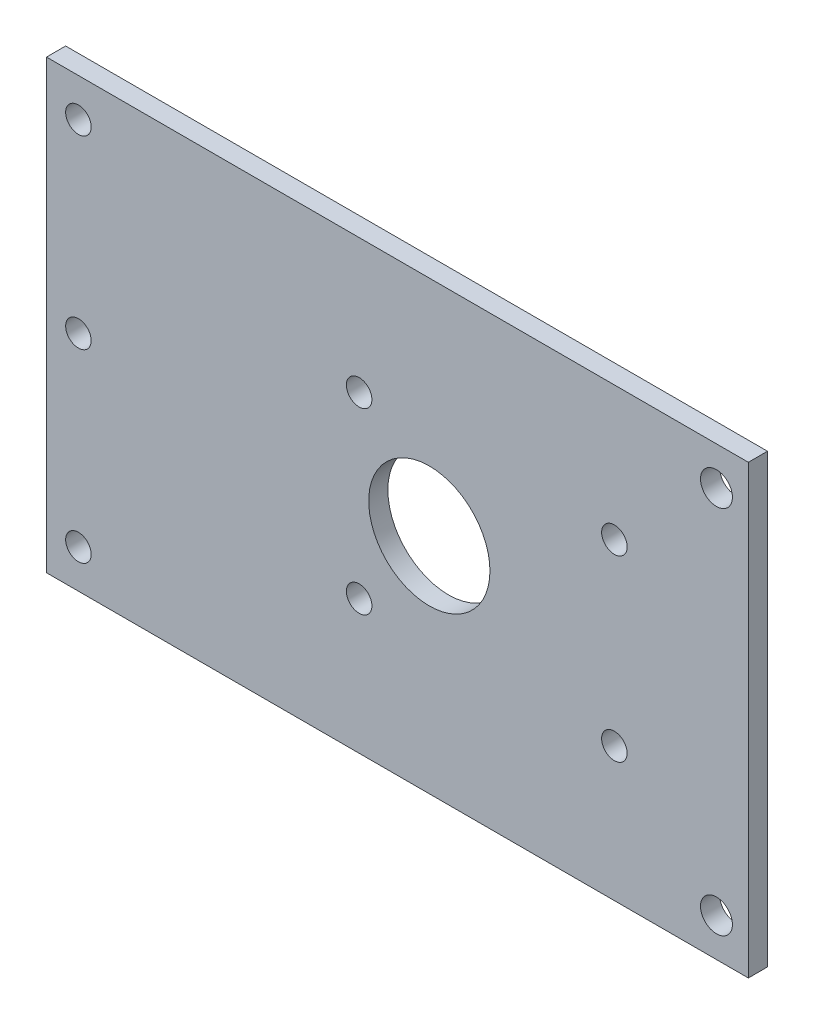
ISO-10303-21;
HEADER;
FILE_DESCRIPTION(('STEP AP214'),'2;1');
FILE_NAME('part.step','',(''),(''),'','','');
FILE_SCHEMA(('AUTOMOTIVE_DESIGN { 1 0 10303 214 1 1 1 1 }'));
ENDSEC;
DATA;
#1=APPLICATION_CONTEXT('core data for automotive mechanical design processes');
#2=APPLICATION_PROTOCOL_DEFINITION('international standard','automotive_design',2000,#1);
#3=PRODUCT_CONTEXT('',#1,'mechanical');
#4=PRODUCT('Part','Part','',(#3));
#5=PRODUCT_RELATED_PRODUCT_CATEGORY('part','',(#4));
#6=PRODUCT_DEFINITION_FORMATION('','',#4);
#7=PRODUCT_DEFINITION_CONTEXT('part definition',#1,'design');
#8=PRODUCT_DEFINITION('design','',#6,#7);
#9=PRODUCT_DEFINITION_SHAPE('','',#8);
#10=(LENGTH_UNIT() NAMED_UNIT(*) SI_UNIT(.MILLI.,.METRE.));
#11=(NAMED_UNIT(*) PLANE_ANGLE_UNIT() SI_UNIT($,.RADIAN.));
#12=(NAMED_UNIT(*) SI_UNIT($,.STERADIAN.) SOLID_ANGLE_UNIT());
#13=UNCERTAINTY_MEASURE_WITH_UNIT(LENGTH_MEASURE(1.E-05),#10,'distance_accuracy_value','');
#14=(GEOMETRIC_REPRESENTATION_CONTEXT(3) GLOBAL_UNCERTAINTY_ASSIGNED_CONTEXT((#13)) GLOBAL_UNIT_ASSIGNED_CONTEXT((#10,
#11,#12)) REPRESENTATION_CONTEXT('',''));
#15=CARTESIAN_POINT('',(0.,0.,0.));
#16=DIRECTION('',(0.,0.,1.));
#17=DIRECTION('',(1.,0.,0.));
#18=AXIS2_PLACEMENT_3D('',#15,#16,#17);
#19=CARTESIAN_POINT('',(0.,0.,3.));
#20=DIRECTION('',(1.,0.,0.));
#21=DIRECTION('',(0.,0.,-1.));
#22=AXIS2_PLACEMENT_3D('',#19,#20,#21);
#23=PLANE('',#22);
#24=DIRECTION('',(0.,-1.,0.));
#25=VECTOR('',#24,1.);
#26=CARTESIAN_POINT('',(0.,0.,0.));
#27=LINE('',#26,#25);
#28=CARTESIAN_POINT('',(0.,70.,0.));
#29=VERTEX_POINT('',#28);
#30=CARTESIAN_POINT('',(0.,0.,0.));
#31=VERTEX_POINT('',#30);
#32=EDGE_CURVE('E102',#29,#31,#27,.T.);
#33=ORIENTED_EDGE('',*,*,#32,.T.);
#34=DIRECTION('',(0.,0.,-1.));
#35=VECTOR('',#34,1.);
#36=CARTESIAN_POINT('',(0.,0.,3.));
#37=LINE('',#36,#35);
#38=CARTESIAN_POINT('',(0.,0.,3.));
#39=VERTEX_POINT('',#38);
#40=EDGE_CURVE('E11',#39,#31,#37,.T.);
#41=ORIENTED_EDGE('',*,*,#40,.F.);
#42=DIRECTION('',(0.,-1.,0.));
#43=VECTOR('',#42,1.);
#44=CARTESIAN_POINT('',(0.,0.,3.));
#45=LINE('',#44,#43);
#46=CARTESIAN_POINT('',(0.,70.,3.));
#47=VERTEX_POINT('',#46);
#48=EDGE_CURVE('E89',#47,#39,#45,.T.);
#49=ORIENTED_EDGE('',*,*,#48,.F.);
#50=DIRECTION('',(0.,0.,-1.));
#51=VECTOR('',#50,1.);
#52=CARTESIAN_POINT('',(0.,70.,3.));
#53=LINE('',#52,#51);
#54=EDGE_CURVE('E98',#47,#29,#53,.T.);
#55=ORIENTED_EDGE('',*,*,#54,.T.);
#56=EDGE_LOOP('',(#33,#41,#49,#55));
#57=FACE_BOUND('',#56,.T.);
#58=ADVANCED_FACE('F36',(#57),#23,.F.);
#59=CARTESIAN_POINT('',(0.,0.,3.));
#60=DIRECTION('',(0.,1.,0.));
#61=DIRECTION('',(0.,0.,1.));
#62=AXIS2_PLACEMENT_3D('',#59,#60,#61);
#63=PLANE('',#62);
#64=DIRECTION('',(1.,0.,0.));
#65=VECTOR('',#64,1.);
#66=CARTESIAN_POINT('',(0.,0.,0.));
#67=LINE('',#66,#65);
#68=CARTESIAN_POINT('',(110.,0.,0.));
#69=VERTEX_POINT('',#68);
#70=EDGE_CURVE('E93',#31,#69,#67,.T.);
#71=ORIENTED_EDGE('',*,*,#70,.T.);
#72=DIRECTION('',(0.,0.,-1.));
#73=VECTOR('',#72,1.);
#74=CARTESIAN_POINT('',(110.,0.,3.));
#75=LINE('',#74,#73);
#76=CARTESIAN_POINT('',(110.,0.,3.));
#77=VERTEX_POINT('',#76);
#78=EDGE_CURVE('E45',#77,#69,#75,.T.);
#79=ORIENTED_EDGE('',*,*,#78,.F.);
#80=DIRECTION('',(1.,0.,0.));
#81=VECTOR('',#80,1.);
#82=CARTESIAN_POINT('',(0.,0.,3.));
#83=LINE('',#82,#81);
#84=EDGE_CURVE('E84',#39,#77,#83,.T.);
#85=ORIENTED_EDGE('',*,*,#84,.F.);
#86=ORIENTED_EDGE('',*,*,#40,.T.);
#87=EDGE_LOOP('',(#71,#79,#85,#86));
#88=FACE_BOUND('',#87,.T.);
#89=ADVANCED_FACE('F92',(#88),#63,.F.);
#90=CARTESIAN_POINT('',(110.,0.,3.));
#91=DIRECTION('',(-1.,0.,0.));
#92=DIRECTION('',(0.,0.,1.));
#93=AXIS2_PLACEMENT_3D('',#90,#91,#92);
#94=PLANE('',#93);
#95=DIRECTION('',(0.,1.,0.));
#96=VECTOR('',#95,1.);
#97=CARTESIAN_POINT('',(110.,0.,0.));
#98=LINE('',#97,#96);
#99=CARTESIAN_POINT('',(110.,70.,0.));
#100=VERTEX_POINT('',#99);
#101=EDGE_CURVE('E71',#69,#100,#98,.T.);
#102=ORIENTED_EDGE('',*,*,#101,.T.);
#103=DIRECTION('',(0.,0.,-1.));
#104=VECTOR('',#103,1.);
#105=CARTESIAN_POINT('',(110.,70.,3.));
#106=LINE('',#105,#104);
#107=CARTESIAN_POINT('',(110.,70.,3.));
#108=VERTEX_POINT('',#107);
#109=EDGE_CURVE('E94',#108,#100,#106,.T.);
#110=ORIENTED_EDGE('',*,*,#109,.F.);
#111=DIRECTION('',(0.,1.,0.));
#112=VECTOR('',#111,1.);
#113=CARTESIAN_POINT('',(110.,0.,3.));
#114=LINE('',#113,#112);
#115=EDGE_CURVE('E87',#77,#108,#114,.T.);
#116=ORIENTED_EDGE('',*,*,#115,.F.);
#117=ORIENTED_EDGE('',*,*,#78,.T.);
#118=EDGE_LOOP('',(#102,#110,#116,#117));
#119=FACE_BOUND('',#118,.T.);
#120=ADVANCED_FACE('F96',(#119),#94,.F.);
#121=CARTESIAN_POINT('',(0.,70.,3.));
#122=DIRECTION('',(0.,-1.,0.));
#123=DIRECTION('',(0.,0.,-1.));
#124=AXIS2_PLACEMENT_3D('',#121,#122,#123);
#125=PLANE('',#124);
#126=DIRECTION('',(-1.,0.,0.));
#127=VECTOR('',#126,1.);
#128=CARTESIAN_POINT('',(0.,70.,0.));
#129=LINE('',#128,#127);
#130=EDGE_CURVE('E77',#100,#29,#129,.T.);
#131=ORIENTED_EDGE('',*,*,#130,.T.);
#132=ORIENTED_EDGE('',*,*,#54,.F.);
#133=DIRECTION('',(-1.,0.,0.));
#134=VECTOR('',#133,1.);
#135=CARTESIAN_POINT('',(0.,70.,3.));
#136=LINE('',#135,#134);
#137=EDGE_CURVE('E54',#108,#47,#136,.T.);
#138=ORIENTED_EDGE('',*,*,#137,.F.);
#139=ORIENTED_EDGE('',*,*,#109,.T.);
#140=EDGE_LOOP('',(#131,#132,#138,#139));
#141=FACE_BOUND('',#140,.T.);
#142=ADVANCED_FACE('F165',(#141),#125,.F.);
#143=CARTESIAN_POINT('',(0.,0.,3.));
#144=DIRECTION('',(0.,0.,-1.));
#145=DIRECTION('',(-1.,0.,0.));
#146=AXIS2_PLACEMENT_3D('',#143,#144,#145);
#147=PLANE('',#146);
#148=CARTESIAN_POINT('',(49.,21.,3.));
#149=DIRECTION('',(0.,0.,1.));
#150=DIRECTION('',(-1.,0.,0.));
#151=AXIS2_PLACEMENT_3D('',#148,#149,#150);
#152=CIRCLE('',#151,2.);
#153=CARTESIAN_POINT('',(47.,21.,3.));
#154=VERTEX_POINT('',#153);
#155=EDGE_CURVE('E307',#154,#154,#152,.T.);
#156=ORIENTED_EDGE('',*,*,#155,.F.);
#157=EDGE_LOOP('',(#156));
#158=FACE_BOUND('',#157,.T.);
#159=CARTESIAN_POINT('',(89.,21.,3.));
#160=DIRECTION('',(0.,0.,1.));
#161=DIRECTION('',(-1.,0.,0.));
#162=AXIS2_PLACEMENT_3D('',#159,#160,#161);
#163=CIRCLE('',#162,2.);
#164=CARTESIAN_POINT('',(87.,21.,3.));
#165=VERTEX_POINT('',#164);
#166=EDGE_CURVE('E308',#165,#165,#163,.T.);
#167=ORIENTED_EDGE('',*,*,#166,.F.);
#168=EDGE_LOOP('',(#167));
#169=FACE_BOUND('',#168,.T.);
#170=CARTESIAN_POINT('',(89.,49.,3.));
#171=DIRECTION('',(0.,0.,1.));
#172=DIRECTION('',(1.,0.,0.));
#173=AXIS2_PLACEMENT_3D('',#170,#171,#172);
#174=CIRCLE('',#173,2.);
#175=CARTESIAN_POINT('',(91.,49.,3.));
#176=VERTEX_POINT('',#175);
#177=EDGE_CURVE('E311',#176,#176,#174,.T.);
#178=ORIENTED_EDGE('',*,*,#177,.F.);
#179=EDGE_LOOP('',(#178));
#180=FACE_BOUND('',#179,.T.);
#181=CARTESIAN_POINT('',(49.,49.,3.));
#182=DIRECTION('',(0.,0.,1.));
#183=DIRECTION('',(1.,0.,0.));
#184=AXIS2_PLACEMENT_3D('',#181,#182,#183);
#185=CIRCLE('',#184,2.);
#186=CARTESIAN_POINT('',(51.,49.,3.));
#187=VERTEX_POINT('',#186);
#188=EDGE_CURVE('E315',#187,#187,#185,.T.);
#189=ORIENTED_EDGE('',*,*,#188,.F.);
#190=EDGE_LOOP('',(#189));
#191=FACE_BOUND('',#190,.T.);
#192=CARTESIAN_POINT('',(60.,35.,3.));
#193=DIRECTION('',(0.,0.,1.));
#194=DIRECTION('',(1.,0.,0.));
#195=AXIS2_PLACEMENT_3D('',#192,#193,#194);
#196=CIRCLE('',#195,9.5);
#197=CARTESIAN_POINT('',(69.5,35.,3.));
#198=VERTEX_POINT('',#197);
#199=EDGE_CURVE('E130',#198,#198,#196,.T.);
#200=ORIENTED_EDGE('',*,*,#199,.F.);
#201=EDGE_LOOP('',(#200));
#202=FACE_BOUND('',#201,.T.);
#203=CARTESIAN_POINT('',(5.,6.,3.));
#204=DIRECTION('',(0.,0.,1.));
#205=DIRECTION('',(1.,0.,0.));
#206=AXIS2_PLACEMENT_3D('',#203,#204,#205);
#207=CIRCLE('',#206,2.);
#208=CARTESIAN_POINT('',(7.,6.,3.));
#209=VERTEX_POINT('',#208);
#210=EDGE_CURVE('E153',#209,#209,#207,.T.);
#211=ORIENTED_EDGE('',*,*,#210,.F.);
#212=EDGE_LOOP('',(#211));
#213=FACE_BOUND('',#212,.T.);
#214=CARTESIAN_POINT('',(105.,64.,3.));
#215=DIRECTION('',(0.,0.,1.));
#216=DIRECTION('',(1.,0.,0.));
#217=AXIS2_PLACEMENT_3D('',#214,#215,#216);
#218=CIRCLE('',#217,2.50000000000001);
#219=CARTESIAN_POINT('',(107.5,64.,3.));
#220=VERTEX_POINT('',#219);
#221=EDGE_CURVE('E149',#220,#220,#218,.T.);
#222=ORIENTED_EDGE('',*,*,#221,.F.);
#223=EDGE_LOOP('',(#222));
#224=FACE_BOUND('',#223,.T.);
#225=CARTESIAN_POINT('',(105.,6.,3.));
#226=DIRECTION('',(0.,0.,1.));
#227=DIRECTION('',(1.,0.,0.));
#228=AXIS2_PLACEMENT_3D('',#225,#226,#227);
#229=CIRCLE('',#228,2.49999999999999);
#230=CARTESIAN_POINT('',(107.5,6.,3.));
#231=VERTEX_POINT('',#230);
#232=EDGE_CURVE('E144',#231,#231,#229,.T.);
#233=ORIENTED_EDGE('',*,*,#232,.F.);
#234=EDGE_LOOP('',(#233));
#235=FACE_BOUND('',#234,.T.);
#236=CARTESIAN_POINT('',(5.,35.,3.));
#237=DIRECTION('',(0.,0.,1.));
#238=DIRECTION('',(1.,0.,0.));
#239=AXIS2_PLACEMENT_3D('',#236,#237,#238);
#240=CIRCLE('',#239,2.);
#241=CARTESIAN_POINT('',(7.00000000000001,35.,3.));
#242=VERTEX_POINT('',#241);
#243=EDGE_CURVE('E140',#242,#242,#240,.T.);
#244=ORIENTED_EDGE('',*,*,#243,.F.);
#245=EDGE_LOOP('',(#244));
#246=FACE_BOUND('',#245,.T.);
#247=CARTESIAN_POINT('',(5.,64.,3.));
#248=DIRECTION('',(0.,0.,1.));
#249=DIRECTION('',(1.,0.,0.));
#250=AXIS2_PLACEMENT_3D('',#247,#248,#249);
#251=CIRCLE('',#250,2.);
#252=CARTESIAN_POINT('',(7.00000000000001,64.,3.));
#253=VERTEX_POINT('',#252);
#254=EDGE_CURVE('E115',#253,#253,#251,.T.);
#255=ORIENTED_EDGE('',*,*,#254,.F.);
#256=EDGE_LOOP('',(#255));
#257=FACE_BOUND('',#256,.T.);
#258=ORIENTED_EDGE('',*,*,#48,.T.);
#259=ORIENTED_EDGE('',*,*,#84,.T.);
#260=ORIENTED_EDGE('',*,*,#115,.T.);
#261=ORIENTED_EDGE('',*,*,#137,.T.);
#262=EDGE_LOOP('',(#258,#259,#260,#261));
#263=FACE_BOUND('',#262,.T.);
#264=ADVANCED_FACE('F85',(#158,#169,#180,#191,#202,#213,#224,#235,#246,#257,#263),#147,.F.);
#265=CARTESIAN_POINT('',(0.,0.,0.));
#266=DIRECTION('',(0.,0.,-1.));
#267=DIRECTION('',(-1.,0.,0.));
#268=AXIS2_PLACEMENT_3D('',#265,#266,#267);
#269=PLANE('',#268);
#270=CARTESIAN_POINT('',(49.,21.,0.));
#271=DIRECTION('',(0.,0.,-1.));
#272=DIRECTION('',(-1.,0.,0.));
#273=AXIS2_PLACEMENT_3D('',#270,#271,#272);
#274=CIRCLE('',#273,2.);
#275=CARTESIAN_POINT('',(47.,21.,0.));
#276=VERTEX_POINT('',#275);
#277=EDGE_CURVE('E39',#276,#276,#274,.T.);
#278=ORIENTED_EDGE('',*,*,#277,.F.);
#279=EDGE_LOOP('',(#278));
#280=FACE_BOUND('',#279,.T.);
#281=CARTESIAN_POINT('',(89.,21.,0.));
#282=DIRECTION('',(0.,0.,-1.));
#283=DIRECTION('',(-1.,0.,0.));
#284=AXIS2_PLACEMENT_3D('',#281,#282,#283);
#285=CIRCLE('',#284,2.);
#286=CARTESIAN_POINT('',(87.,21.,0.));
#287=VERTEX_POINT('',#286);
#288=EDGE_CURVE('E135',#287,#287,#285,.T.);
#289=ORIENTED_EDGE('',*,*,#288,.F.);
#290=EDGE_LOOP('',(#289));
#291=FACE_BOUND('',#290,.T.);
#292=CARTESIAN_POINT('',(89.,49.,0.));
#293=DIRECTION('',(0.,0.,-1.));
#294=DIRECTION('',(-1.,0.,0.));
#295=AXIS2_PLACEMENT_3D('',#292,#293,#294);
#296=CIRCLE('',#295,2.);
#297=CARTESIAN_POINT('',(87.,49.,0.));
#298=VERTEX_POINT('',#297);
#299=EDGE_CURVE('E133',#298,#298,#296,.T.);
#300=ORIENTED_EDGE('',*,*,#299,.F.);
#301=EDGE_LOOP('',(#300));
#302=FACE_BOUND('',#301,.T.);
#303=CARTESIAN_POINT('',(49.,49.,0.));
#304=DIRECTION('',(0.,0.,-1.));
#305=DIRECTION('',(-1.,0.,0.));
#306=AXIS2_PLACEMENT_3D('',#303,#304,#305);
#307=CIRCLE('',#306,2.);
#308=CARTESIAN_POINT('',(47.,49.,0.));
#309=VERTEX_POINT('',#308);
#310=EDGE_CURVE('E129',#309,#309,#307,.T.);
#311=ORIENTED_EDGE('',*,*,#310,.F.);
#312=EDGE_LOOP('',(#311));
#313=FACE_BOUND('',#312,.T.);
#314=CARTESIAN_POINT('',(60.,35.,0.));
#315=DIRECTION('',(0.,0.,-1.));
#316=DIRECTION('',(-1.,0.,0.));
#317=AXIS2_PLACEMENT_3D('',#314,#315,#316);
#318=CIRCLE('',#317,9.5);
#319=CARTESIAN_POINT('',(50.5,35.,0.));
#320=VERTEX_POINT('',#319);
#321=EDGE_CURVE('E126',#320,#320,#318,.T.);
#322=ORIENTED_EDGE('',*,*,#321,.F.);
#323=EDGE_LOOP('',(#322));
#324=FACE_BOUND('',#323,.T.);
#325=CARTESIAN_POINT('',(5.,6.,0.));
#326=DIRECTION('',(0.,0.,-1.));
#327=DIRECTION('',(-1.,0.,0.));
#328=AXIS2_PLACEMENT_3D('',#325,#326,#327);
#329=CIRCLE('',#328,2.);
#330=CARTESIAN_POINT('',(3.,6.,0.));
#331=VERTEX_POINT('',#330);
#332=EDGE_CURVE('E105',#331,#331,#329,.T.);
#333=ORIENTED_EDGE('',*,*,#332,.F.);
#334=EDGE_LOOP('',(#333));
#335=FACE_BOUND('',#334,.T.);
#336=CARTESIAN_POINT('',(105.,64.,0.));
#337=DIRECTION('',(0.,0.,-1.));
#338=DIRECTION('',(-1.,0.,0.));
#339=AXIS2_PLACEMENT_3D('',#336,#337,#338);
#340=CIRCLE('',#339,2.50000000000001);
#341=CARTESIAN_POINT('',(102.5,64.,0.));
#342=VERTEX_POINT('',#341);
#343=EDGE_CURVE('E121',#342,#342,#340,.T.);
#344=ORIENTED_EDGE('',*,*,#343,.F.);
#345=EDGE_LOOP('',(#344));
#346=FACE_BOUND('',#345,.T.);
#347=CARTESIAN_POINT('',(105.,6.,0.));
#348=DIRECTION('',(0.,0.,-1.));
#349=DIRECTION('',(-1.,0.,0.));
#350=AXIS2_PLACEMENT_3D('',#347,#348,#349);
#351=CIRCLE('',#350,2.49999999999999);
#352=CARTESIAN_POINT('',(102.5,6.,0.));
#353=VERTEX_POINT('',#352);
#354=EDGE_CURVE('E118',#353,#353,#351,.T.);
#355=ORIENTED_EDGE('',*,*,#354,.F.);
#356=EDGE_LOOP('',(#355));
#357=FACE_BOUND('',#356,.T.);
#358=CARTESIAN_POINT('',(5.,35.,0.));
#359=DIRECTION('',(0.,0.,-1.));
#360=DIRECTION('',(-1.,0.,0.));
#361=AXIS2_PLACEMENT_3D('',#358,#359,#360);
#362=CIRCLE('',#361,2.);
#363=CARTESIAN_POINT('',(3.,35.,0.));
#364=VERTEX_POINT('',#363);
#365=EDGE_CURVE('E114',#364,#364,#362,.T.);
#366=ORIENTED_EDGE('',*,*,#365,.F.);
#367=EDGE_LOOP('',(#366));
#368=FACE_BOUND('',#367,.T.);
#369=CARTESIAN_POINT('',(5.,64.,0.));
#370=DIRECTION('',(0.,0.,-1.));
#371=DIRECTION('',(-1.,0.,0.));
#372=AXIS2_PLACEMENT_3D('',#369,#370,#371);
#373=CIRCLE('',#372,2.);
#374=CARTESIAN_POINT('',(3.,64.,0.));
#375=VERTEX_POINT('',#374);
#376=EDGE_CURVE('E111',#375,#375,#373,.T.);
#377=ORIENTED_EDGE('',*,*,#376,.F.);
#378=EDGE_LOOP('',(#377));
#379=FACE_BOUND('',#378,.T.);
#380=ORIENTED_EDGE('',*,*,#32,.F.);
#381=ORIENTED_EDGE('',*,*,#130,.F.);
#382=ORIENTED_EDGE('',*,*,#101,.F.);
#383=ORIENTED_EDGE('',*,*,#70,.F.);
#384=EDGE_LOOP('',(#380,#381,#382,#383));
#385=FACE_BOUND('',#384,.T.);
#386=ADVANCED_FACE('F164',(#280,#291,#302,#313,#324,#335,#346,#357,#368,#379,#385),#269,.T.);
#387=CARTESIAN_POINT('',(5.,64.,-2.));
#388=DIRECTION('',(0.,0.,1.));
#389=DIRECTION('',(1.,0.,0.));
#390=AXIS2_PLACEMENT_3D('',#387,#388,#389);
#391=CYLINDRICAL_SURFACE('',#390,2.);
#392=ORIENTED_EDGE('',*,*,#376,.T.);
#393=EDGE_LOOP('',(#392));
#394=FACE_BOUND('',#393,.T.);
#395=ORIENTED_EDGE('',*,*,#254,.T.);
#396=EDGE_LOOP('',(#395));
#397=FACE_BOUND('',#396,.T.);
#398=ADVANCED_FACE('F161',(#394,#397),#391,.F.);
#399=CARTESIAN_POINT('',(5.,35.,-2.));
#400=DIRECTION('',(0.,0.,1.));
#401=DIRECTION('',(1.,0.,0.));
#402=AXIS2_PLACEMENT_3D('',#399,#400,#401);
#403=CYLINDRICAL_SURFACE('',#402,2.);
#404=ORIENTED_EDGE('',*,*,#365,.T.);
#405=EDGE_LOOP('',(#404));
#406=FACE_BOUND('',#405,.T.);
#407=ORIENTED_EDGE('',*,*,#243,.T.);
#408=EDGE_LOOP('',(#407));
#409=FACE_BOUND('',#408,.T.);
#410=ADVANCED_FACE('F205',(#406,#409),#403,.F.);
#411=CARTESIAN_POINT('',(105.,6.,-2.));
#412=DIRECTION('',(0.,0.,1.));
#413=DIRECTION('',(1.,0.,0.));
#414=AXIS2_PLACEMENT_3D('',#411,#412,#413);
#415=CYLINDRICAL_SURFACE('',#414,2.49999999999999);
#416=ORIENTED_EDGE('',*,*,#354,.T.);
#417=EDGE_LOOP('',(#416));
#418=FACE_BOUND('',#417,.T.);
#419=ORIENTED_EDGE('',*,*,#232,.T.);
#420=EDGE_LOOP('',(#419));
#421=FACE_BOUND('',#420,.T.);
#422=ADVANCED_FACE('F215',(#418,#421),#415,.F.);
#423=CARTESIAN_POINT('',(105.,64.,-2.));
#424=DIRECTION('',(0.,0.,1.));
#425=DIRECTION('',(1.,0.,0.));
#426=AXIS2_PLACEMENT_3D('',#423,#424,#425);
#427=CYLINDRICAL_SURFACE('',#426,2.50000000000001);
#428=ORIENTED_EDGE('',*,*,#343,.T.);
#429=EDGE_LOOP('',(#428));
#430=FACE_BOUND('',#429,.T.);
#431=ORIENTED_EDGE('',*,*,#221,.T.);
#432=EDGE_LOOP('',(#431));
#433=FACE_BOUND('',#432,.T.);
#434=ADVANCED_FACE('F225',(#430,#433),#427,.F.);
#435=CARTESIAN_POINT('',(5.,6.,-2.));
#436=DIRECTION('',(0.,0.,1.));
#437=DIRECTION('',(1.,0.,0.));
#438=AXIS2_PLACEMENT_3D('',#435,#436,#437);
#439=CYLINDRICAL_SURFACE('',#438,2.);
#440=ORIENTED_EDGE('',*,*,#332,.T.);
#441=EDGE_LOOP('',(#440));
#442=FACE_BOUND('',#441,.T.);
#443=ORIENTED_EDGE('',*,*,#210,.T.);
#444=EDGE_LOOP('',(#443));
#445=FACE_BOUND('',#444,.T.);
#446=ADVANCED_FACE('F235',(#442,#445),#439,.F.);
#447=CARTESIAN_POINT('',(60.,35.,-6.));
#448=DIRECTION('',(0.,0.,1.));
#449=DIRECTION('',(1.,0.,0.));
#450=AXIS2_PLACEMENT_3D('',#447,#448,#449);
#451=CYLINDRICAL_SURFACE('',#450,9.5);
#452=ORIENTED_EDGE('',*,*,#321,.T.);
#453=EDGE_LOOP('',(#452));
#454=FACE_BOUND('',#453,.T.);
#455=ORIENTED_EDGE('',*,*,#199,.T.);
#456=EDGE_LOOP('',(#455));
#457=FACE_BOUND('',#456,.T.);
#458=ADVANCED_FACE('F244',(#454,#457),#451,.F.);
#459=CARTESIAN_POINT('',(49.,49.,-6.));
#460=DIRECTION('',(0.,0.,1.));
#461=DIRECTION('',(1.,0.,0.));
#462=AXIS2_PLACEMENT_3D('',#459,#460,#461);
#463=CYLINDRICAL_SURFACE('',#462,2.);
#464=ORIENTED_EDGE('',*,*,#310,.T.);
#465=EDGE_LOOP('',(#464));
#466=FACE_BOUND('',#465,.T.);
#467=ORIENTED_EDGE('',*,*,#188,.T.);
#468=EDGE_LOOP('',(#467));
#469=FACE_BOUND('',#468,.T.);
#470=ADVANCED_FACE('F263',(#466,#469),#463,.F.);
#471=CARTESIAN_POINT('',(89.,49.,-6.));
#472=DIRECTION('',(0.,0.,1.));
#473=DIRECTION('',(1.,0.,0.));
#474=AXIS2_PLACEMENT_3D('',#471,#472,#473);
#475=CYLINDRICAL_SURFACE('',#474,2.);
#476=ORIENTED_EDGE('',*,*,#299,.T.);
#477=EDGE_LOOP('',(#476));
#478=FACE_BOUND('',#477,.T.);
#479=ORIENTED_EDGE('',*,*,#177,.T.);
#480=EDGE_LOOP('',(#479));
#481=FACE_BOUND('',#480,.T.);
#482=ADVANCED_FACE('F273',(#478,#481),#475,.F.);
#483=CARTESIAN_POINT('',(89.,21.,-6.));
#484=DIRECTION('',(0.,0.,1.));
#485=DIRECTION('',(1.,0.,0.));
#486=AXIS2_PLACEMENT_3D('',#483,#484,#485);
#487=CYLINDRICAL_SURFACE('',#486,2.);
#488=ORIENTED_EDGE('',*,*,#288,.T.);
#489=EDGE_LOOP('',(#488));
#490=FACE_BOUND('',#489,.T.);
#491=ORIENTED_EDGE('',*,*,#166,.T.);
#492=EDGE_LOOP('',(#491));
#493=FACE_BOUND('',#492,.T.);
#494=ADVANCED_FACE('F283',(#490,#493),#487,.F.);
#495=CARTESIAN_POINT('',(49.,21.,-6.));
#496=DIRECTION('',(0.,0.,1.));
#497=DIRECTION('',(1.,0.,0.));
#498=AXIS2_PLACEMENT_3D('',#495,#496,#497);
#499=CYLINDRICAL_SURFACE('',#498,2.);
#500=ORIENTED_EDGE('',*,*,#277,.T.);
#501=EDGE_LOOP('',(#500));
#502=FACE_BOUND('',#501,.T.);
#503=ORIENTED_EDGE('',*,*,#155,.T.);
#504=EDGE_LOOP('',(#503));
#505=FACE_BOUND('',#504,.T.);
#506=ADVANCED_FACE('F293',(#502,#505),#499,.F.);
#507=CLOSED_SHELL('',(#58,#89,#120,#142,#264,#386,#398,#410,#422,#434,#446,#458,#470,#482,#494,#506));
#508=MANIFOLD_SOLID_BREP('B2',#507);
#509=ADVANCED_BREP_SHAPE_REPRESENTATION('',(#18,#508),#14);
#510=SHAPE_DEFINITION_REPRESENTATION(#9,#509);
ENDSEC;
END-ISO-10303-21;
